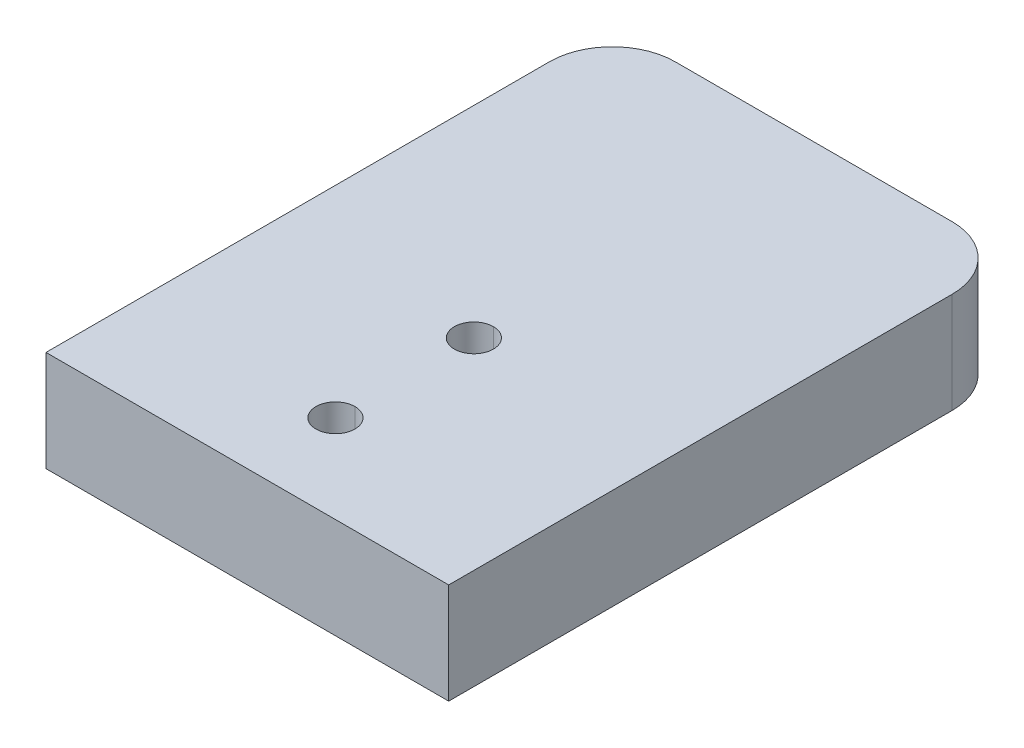
ISO-10303-21;
HEADER;
FILE_DESCRIPTION(('STEP AP214'),'2;1');
FILE_NAME('part.step','',(''),(''),'','','');
FILE_SCHEMA(('AUTOMOTIVE_DESIGN { 1 0 10303 214 1 1 1 1 }'));
ENDSEC;
DATA;
#1=APPLICATION_CONTEXT('core data for automotive mechanical design processes');
#2=APPLICATION_PROTOCOL_DEFINITION('international standard','automotive_design',2000,#1);
#3=PRODUCT_CONTEXT('',#1,'mechanical');
#4=PRODUCT('Part','Part','',(#3));
#5=PRODUCT_RELATED_PRODUCT_CATEGORY('part','',(#4));
#6=PRODUCT_DEFINITION_FORMATION('','',#4);
#7=PRODUCT_DEFINITION_CONTEXT('part definition',#1,'design');
#8=PRODUCT_DEFINITION('design','',#6,#7);
#9=PRODUCT_DEFINITION_SHAPE('','',#8);
#10=(LENGTH_UNIT() NAMED_UNIT(*) SI_UNIT(.MILLI.,.METRE.));
#11=(NAMED_UNIT(*) PLANE_ANGLE_UNIT() SI_UNIT($,.RADIAN.));
#12=(NAMED_UNIT(*) SI_UNIT($,.STERADIAN.) SOLID_ANGLE_UNIT());
#13=UNCERTAINTY_MEASURE_WITH_UNIT(LENGTH_MEASURE(1.E-05),#10,'distance_accuracy_value','');
#14=(GEOMETRIC_REPRESENTATION_CONTEXT(3) GLOBAL_UNCERTAINTY_ASSIGNED_CONTEXT((#13)) GLOBAL_UNIT_ASSIGNED_CONTEXT((#10,
#11,#12)) REPRESENTATION_CONTEXT('',''));
#15=CARTESIAN_POINT('',(0.,0.,0.));
#16=DIRECTION('',(0.,0.,1.));
#17=DIRECTION('',(1.,0.,0.));
#18=AXIS2_PLACEMENT_3D('',#15,#16,#17);
#19=CARTESIAN_POINT('',(0.,8.,4.5));
#20=DIRECTION('',(0.,-1.,0.));
#21=DIRECTION('',(0.,0.,-1.));
#22=AXIS2_PLACEMENT_3D('',#19,#20,#21);
#23=CYLINDRICAL_SURFACE('',#22,1.55);
#24=CARTESIAN_POINT('',(0.,8.,4.5));
#25=DIRECTION('',(0.,1.,0.));
#26=DIRECTION('',(0.,0.,1.));
#27=AXIS2_PLACEMENT_3D('',#24,#25,#26);
#28=CIRCLE('',#27,1.55);
#29=CARTESIAN_POINT('',(0.,8.,2.95));
#30=VERTEX_POINT('',#29);
#31=CARTESIAN_POINT('',(0.,8.,6.05));
#32=VERTEX_POINT('',#31);
#33=EDGE_CURVE('E281',#30,#32,#28,.T.);
#34=ORIENTED_EDGE('',*,*,#33,.T.);
#35=DIRECTION('',(0.,-1.,0.));
#36=VECTOR('',#35,1.);
#37=CARTESIAN_POINT('',(0.,8.,6.05));
#38=LINE('',#37,#36);
#39=CARTESIAN_POINT('',(0.,2.8,6.05));
#40=VERTEX_POINT('',#39);
#41=EDGE_CURVE('E307',#32,#40,#38,.T.);
#42=ORIENTED_EDGE('',*,*,#41,.T.);
#43=CARTESIAN_POINT('',(0.,2.8,4.5));
#44=DIRECTION('',(0.,-1.,0.));
#45=DIRECTION('',(0.,0.,-1.));
#46=AXIS2_PLACEMENT_3D('',#43,#44,#45);
#47=CIRCLE('',#46,1.55);
#48=CARTESIAN_POINT('',(0.,2.8,2.95));
#49=VERTEX_POINT('',#48);
#50=EDGE_CURVE('E337',#40,#49,#47,.T.);
#51=ORIENTED_EDGE('',*,*,#50,.T.);
#52=DIRECTION('',(0.,-1.,0.));
#53=VECTOR('',#52,1.);
#54=CARTESIAN_POINT('',(0.,8.,2.95));
#55=LINE('',#54,#53);
#56=EDGE_CURVE('E311',#30,#49,#55,.T.);
#57=ORIENTED_EDGE('',*,*,#56,.F.);
#58=EDGE_LOOP('',(#34,#42,#51,#57));
#59=FACE_BOUND('',#58,.T.);
#60=ADVANCED_FACE('F16',(#59),#23,.F.);
#61=CARTESIAN_POINT('',(0.,8.,15.5));
#62=DIRECTION('',(0.,-1.,0.));
#63=DIRECTION('',(0.,0.,-1.));
#64=AXIS2_PLACEMENT_3D('',#61,#62,#63);
#65=CYLINDRICAL_SURFACE('',#64,1.55);
#66=CARTESIAN_POINT('',(0.,8.,15.5));
#67=DIRECTION('',(0.,1.,0.));
#68=DIRECTION('',(0.,0.,1.));
#69=AXIS2_PLACEMENT_3D('',#66,#67,#68);
#70=CIRCLE('',#69,1.55);
#71=CARTESIAN_POINT('',(0.,8.,13.95));
#72=VERTEX_POINT('',#71);
#73=CARTESIAN_POINT('',(0.,8.,17.05));
#74=VERTEX_POINT('',#73);
#75=EDGE_CURVE('E328',#72,#74,#70,.T.);
#76=ORIENTED_EDGE('',*,*,#75,.T.);
#77=DIRECTION('',(0.,-1.,0.));
#78=VECTOR('',#77,1.);
#79=CARTESIAN_POINT('',(0.,8.,17.05));
#80=LINE('',#79,#78);
#81=CARTESIAN_POINT('',(0.,2.8,17.05));
#82=VERTEX_POINT('',#81);
#83=EDGE_CURVE('E27',#74,#82,#80,.T.);
#84=ORIENTED_EDGE('',*,*,#83,.T.);
#85=CARTESIAN_POINT('',(0.,2.8,15.5));
#86=DIRECTION('',(0.,-1.,0.));
#87=DIRECTION('',(0.,0.,-1.));
#88=AXIS2_PLACEMENT_3D('',#85,#86,#87);
#89=CIRCLE('',#88,1.55);
#90=CARTESIAN_POINT('',(0.,2.8,13.95));
#91=VERTEX_POINT('',#90);
#92=EDGE_CURVE('E318',#82,#91,#89,.T.);
#93=ORIENTED_EDGE('',*,*,#92,.T.);
#94=DIRECTION('',(0.,-1.,0.));
#95=VECTOR('',#94,1.);
#96=CARTESIAN_POINT('',(0.,8.,13.95));
#97=LINE('',#96,#95);
#98=EDGE_CURVE('E11',#72,#91,#97,.T.);
#99=ORIENTED_EDGE('',*,*,#98,.F.);
#100=EDGE_LOOP('',(#76,#84,#93,#99));
#101=FACE_BOUND('',#100,.T.);
#102=ADVANCED_FACE('F511',(#101),#65,.F.);
#103=CARTESIAN_POINT('',(0.,8.,15.5));
#104=DIRECTION('',(0.,-1.,0.));
#105=DIRECTION('',(0.,0.,-1.));
#106=AXIS2_PLACEMENT_3D('',#103,#104,#105);
#107=CYLINDRICAL_SURFACE('',#106,1.55);
#108=ORIENTED_EDGE('',*,*,#83,.F.);
#109=CARTESIAN_POINT('',(0.,8.,15.5));
#110=DIRECTION('',(0.,1.,0.));
#111=DIRECTION('',(0.,0.,1.));
#112=AXIS2_PLACEMENT_3D('',#109,#110,#111);
#113=CIRCLE('',#112,1.55);
#114=EDGE_CURVE('E312',#74,#72,#113,.T.);
#115=ORIENTED_EDGE('',*,*,#114,.T.);
#116=ORIENTED_EDGE('',*,*,#98,.T.);
#117=CARTESIAN_POINT('',(0.,2.8,15.5));
#118=DIRECTION('',(0.,-1.,0.));
#119=DIRECTION('',(0.,0.,-1.));
#120=AXIS2_PLACEMENT_3D('',#117,#118,#119);
#121=CIRCLE('',#120,1.55);
#122=EDGE_CURVE('E323',#91,#82,#121,.T.);
#123=ORIENTED_EDGE('',*,*,#122,.T.);
#124=EDGE_LOOP('',(#108,#115,#116,#123));
#125=FACE_BOUND('',#124,.T.);
#126=ADVANCED_FACE('F517',(#125),#107,.F.);
#127=CARTESIAN_POINT('',(0.,8.,4.5));
#128=DIRECTION('',(0.,-1.,0.));
#129=DIRECTION('',(0.,0.,-1.));
#130=AXIS2_PLACEMENT_3D('',#127,#128,#129);
#131=CYLINDRICAL_SURFACE('',#130,1.55);
#132=ORIENTED_EDGE('',*,*,#41,.F.);
#133=CARTESIAN_POINT('',(0.,8.,4.5));
#134=DIRECTION('',(0.,1.,0.));
#135=DIRECTION('',(0.,0.,1.));
#136=AXIS2_PLACEMENT_3D('',#133,#134,#135);
#137=CIRCLE('',#136,1.55);
#138=EDGE_CURVE('E324',#32,#30,#137,.T.);
#139=ORIENTED_EDGE('',*,*,#138,.T.);
#140=ORIENTED_EDGE('',*,*,#56,.T.);
#141=CARTESIAN_POINT('',(0.,2.8,4.5));
#142=DIRECTION('',(0.,-1.,0.));
#143=DIRECTION('',(0.,0.,-1.));
#144=AXIS2_PLACEMENT_3D('',#141,#142,#143);
#145=CIRCLE('',#144,1.55);
#146=EDGE_CURVE('E336',#49,#40,#145,.T.);
#147=ORIENTED_EDGE('',*,*,#146,.T.);
#148=EDGE_LOOP('',(#132,#139,#140,#147));
#149=FACE_BOUND('',#148,.T.);
#150=ADVANCED_FACE('F769',(#149),#131,.F.);
#151=CARTESIAN_POINT('',(0.,8.,0.));
#152=DIRECTION('',(0.,1.,0.));
#153=DIRECTION('',(1.,0.,0.));
#154=AXIS2_PLACEMENT_3D('',#151,#152,#153);
#155=PLANE('',#154);
#156=ORIENTED_EDGE('',*,*,#75,.F.);
#157=ORIENTED_EDGE('',*,*,#114,.F.);
#158=EDGE_LOOP('',(#156,#157));
#159=FACE_BOUND('',#158,.T.);
#160=ORIENTED_EDGE('',*,*,#33,.F.);
#161=ORIENTED_EDGE('',*,*,#138,.F.);
#162=EDGE_LOOP('',(#160,#161));
#163=FACE_BOUND('',#162,.T.);
#164=DIRECTION('',(0.,0.,-1.));
#165=VECTOR('',#164,1.);
#166=CARTESIAN_POINT('',(16.,8.,-22.5));
#167=LINE('',#166,#165);
#168=CARTESIAN_POINT('',(16.,8.,22.5));
#169=VERTEX_POINT('',#168);
#170=CARTESIAN_POINT('',(16.,8.,-17.5));
#171=VERTEX_POINT('',#170);
#172=EDGE_CURVE('E278',#169,#171,#167,.T.);
#173=ORIENTED_EDGE('',*,*,#172,.T.);
#174=CARTESIAN_POINT('',(11.,8.,-17.5));
#175=DIRECTION('',(0.,1.,0.));
#176=DIRECTION('',(0.,0.,1.));
#177=AXIS2_PLACEMENT_3D('',#174,#175,#176);
#178=CIRCLE('',#177,5.);
#179=CARTESIAN_POINT('',(11.,8.,-22.5));
#180=VERTEX_POINT('',#179);
#181=EDGE_CURVE('E424',#171,#180,#178,.T.);
#182=ORIENTED_EDGE('',*,*,#181,.T.);
#183=DIRECTION('',(-1.,0.,0.));
#184=VECTOR('',#183,1.);
#185=CARTESIAN_POINT('',(-16.,8.,-22.5));
#186=LINE('',#185,#184);
#187=CARTESIAN_POINT('',(-11.,8.,-22.5));
#188=VERTEX_POINT('',#187);
#189=EDGE_CURVE('E229',#180,#188,#186,.T.);
#190=ORIENTED_EDGE('',*,*,#189,.T.);
#191=CARTESIAN_POINT('',(-11.,8.,-17.5));
#192=DIRECTION('',(0.,1.,0.));
#193=DIRECTION('',(0.,0.,1.));
#194=AXIS2_PLACEMENT_3D('',#191,#192,#193);
#195=CIRCLE('',#194,5.);
#196=CARTESIAN_POINT('',(-16.,8.,-17.5));
#197=VERTEX_POINT('',#196);
#198=EDGE_CURVE('E287',#188,#197,#195,.T.);
#199=ORIENTED_EDGE('',*,*,#198,.T.);
#200=DIRECTION('',(0.,0.,1.));
#201=VECTOR('',#200,1.);
#202=CARTESIAN_POINT('',(-16.,8.,-22.5));
#203=LINE('',#202,#201);
#204=CARTESIAN_POINT('',(-16.,8.,22.5));
#205=VERTEX_POINT('',#204);
#206=EDGE_CURVE('E230',#197,#205,#203,.T.);
#207=ORIENTED_EDGE('',*,*,#206,.T.);
#208=DIRECTION('',(1.,0.,0.));
#209=VECTOR('',#208,1.);
#210=CARTESIAN_POINT('',(-16.,8.,22.5));
#211=LINE('',#210,#209);
#212=EDGE_CURVE('E238',#205,#169,#211,.T.);
#213=ORIENTED_EDGE('',*,*,#212,.T.);
#214=EDGE_LOOP('',(#173,#182,#190,#199,#207,#213));
#215=FACE_BOUND('',#214,.T.);
#216=ADVANCED_FACE('F760',(#159,#163,#215),#155,.T.);
#217=CARTESIAN_POINT('',(0.,0.,0.));
#218=DIRECTION('',(0.,1.,0.));
#219=DIRECTION('',(1.,0.,0.));
#220=AXIS2_PLACEMENT_3D('',#217,#218,#219);
#221=PLANE('',#220);
#222=DIRECTION('',(-0.5,0.,0.866025403784439));
#223=VECTOR('',#222,1.);
#224=CARTESIAN_POINT('',(3.34863156129984,0.,15.5));
#225=LINE('',#224,#223);
#226=CARTESIAN_POINT('',(3.34863156129984,0.,15.5));
#227=VERTEX_POINT('',#226);
#228=CARTESIAN_POINT('',(1.67431578064992,0.,18.4));
#229=VERTEX_POINT('',#228);
#230=EDGE_CURVE('E322',#227,#229,#225,.T.);
#231=ORIENTED_EDGE('',*,*,#230,.F.);
#232=DIRECTION('',(0.5,0.,0.866025403784439));
#233=VECTOR('',#232,1.);
#234=CARTESIAN_POINT('',(1.67431578064992,0.,12.6));
#235=LINE('',#234,#233);
#236=CARTESIAN_POINT('',(1.67431578064992,0.,12.6));
#237=VERTEX_POINT('',#236);
#238=EDGE_CURVE('E276',#237,#227,#235,.T.);
#239=ORIENTED_EDGE('',*,*,#238,.F.);
#240=DIRECTION('',(1.,0.,0.));
#241=VECTOR('',#240,1.);
#242=CARTESIAN_POINT('',(-1.67431578064991,0.,12.6));
#243=LINE('',#242,#241);
#244=CARTESIAN_POINT('',(-1.67431578064991,0.,12.6));
#245=VERTEX_POINT('',#244);
#246=EDGE_CURVE('E277',#245,#237,#243,.T.);
#247=ORIENTED_EDGE('',*,*,#246,.F.);
#248=DIRECTION('',(0.5,0.,-0.866025403784439));
#249=VECTOR('',#248,1.);
#250=CARTESIAN_POINT('',(-3.34863156129982,0.,15.5));
#251=LINE('',#250,#249);
#252=CARTESIAN_POINT('',(-3.34863156129982,0.,15.5));
#253=VERTEX_POINT('',#252);
#254=EDGE_CURVE('E317',#253,#245,#251,.T.);
#255=ORIENTED_EDGE('',*,*,#254,.F.);
#256=DIRECTION('',(-0.5,0.,-0.866025403784439));
#257=VECTOR('',#256,1.);
#258=CARTESIAN_POINT('',(-1.6743157806499,0.,18.4));
#259=LINE('',#258,#257);
#260=CARTESIAN_POINT('',(-1.6743157806499,0.,18.4));
#261=VERTEX_POINT('',#260);
#262=EDGE_CURVE('E355',#261,#253,#259,.T.);
#263=ORIENTED_EDGE('',*,*,#262,.F.);
#264=DIRECTION('',(-1.,0.,0.));
#265=VECTOR('',#264,1.);
#266=CARTESIAN_POINT('',(1.67431578064992,0.,18.4));
#267=LINE('',#266,#265);
#268=EDGE_CURVE('E331',#229,#261,#267,.T.);
#269=ORIENTED_EDGE('',*,*,#268,.F.);
#270=EDGE_LOOP('',(#231,#239,#247,#255,#263,#269));
#271=FACE_BOUND('',#270,.T.);
#272=DIRECTION('',(0.5,0.,0.866025403784439));
#273=VECTOR('',#272,1.);
#274=CARTESIAN_POINT('',(1.67431578064992,0.,1.6));
#275=LINE('',#274,#273);
#276=CARTESIAN_POINT('',(1.67431578064992,0.,1.6));
#277=VERTEX_POINT('',#276);
#278=CARTESIAN_POINT('',(3.34863156129984,0.,4.5));
#279=VERTEX_POINT('',#278);
#280=EDGE_CURVE('E341',#277,#279,#275,.T.);
#281=ORIENTED_EDGE('',*,*,#280,.F.);
#282=DIRECTION('',(1.,0.,0.));
#283=VECTOR('',#282,1.);
#284=CARTESIAN_POINT('',(-1.67431578064991,0.,1.6));
#285=LINE('',#284,#283);
#286=CARTESIAN_POINT('',(-1.67431578064991,0.,1.6));
#287=VERTEX_POINT('',#286);
#288=EDGE_CURVE('E247',#287,#277,#285,.T.);
#289=ORIENTED_EDGE('',*,*,#288,.F.);
#290=DIRECTION('',(0.5,0.,-0.866025403784439));
#291=VECTOR('',#290,1.);
#292=CARTESIAN_POINT('',(-3.34863156129982,0.,4.5));
#293=LINE('',#292,#291);
#294=CARTESIAN_POINT('',(-3.34863156129982,0.,4.5));
#295=VERTEX_POINT('',#294);
#296=EDGE_CURVE('E395',#295,#287,#293,.T.);
#297=ORIENTED_EDGE('',*,*,#296,.F.);
#298=DIRECTION('',(-0.5,0.,-0.866025403784439));
#299=VECTOR('',#298,1.);
#300=CARTESIAN_POINT('',(-1.67431578064991,0.,7.4));
#301=LINE('',#300,#299);
#302=CARTESIAN_POINT('',(-1.67431578064991,0.,7.4));
#303=VERTEX_POINT('',#302);
#304=EDGE_CURVE('E364',#303,#295,#301,.T.);
#305=ORIENTED_EDGE('',*,*,#304,.F.);
#306=DIRECTION('',(-1.,0.,0.));
#307=VECTOR('',#306,1.);
#308=CARTESIAN_POINT('',(1.67431578064992,0.,7.4));
#309=LINE('',#308,#307);
#310=CARTESIAN_POINT('',(1.67431578064992,0.,7.4));
#311=VERTEX_POINT('',#310);
#312=EDGE_CURVE('E292',#311,#303,#309,.T.);
#313=ORIENTED_EDGE('',*,*,#312,.F.);
#314=DIRECTION('',(-0.5,0.,0.866025403784439));
#315=VECTOR('',#314,1.);
#316=CARTESIAN_POINT('',(3.34863156129984,0.,4.5));
#317=LINE('',#316,#315);
#318=EDGE_CURVE('E293',#279,#311,#317,.T.);
#319=ORIENTED_EDGE('',*,*,#318,.F.);
#320=EDGE_LOOP('',(#281,#289,#297,#305,#313,#319));
#321=FACE_BOUND('',#320,.T.);
#322=DIRECTION('',(-1.,0.,0.));
#323=VECTOR('',#322,1.);
#324=CARTESIAN_POINT('',(-16.,0.,-22.5));
#325=LINE('',#324,#323);
#326=CARTESIAN_POINT('',(11.,0.,-22.5));
#327=VERTEX_POINT('',#326);
#328=CARTESIAN_POINT('',(-11.,0.,-22.5));
#329=VERTEX_POINT('',#328);
#330=EDGE_CURVE('E372',#327,#329,#325,.T.);
#331=ORIENTED_EDGE('',*,*,#330,.F.);
#332=CARTESIAN_POINT('',(11.,0.,-17.5));
#333=DIRECTION('',(0.,-1.,0.));
#334=DIRECTION('',(0.,0.,1.));
#335=AXIS2_PLACEMENT_3D('',#332,#333,#334);
#336=CIRCLE('',#335,5.);
#337=CARTESIAN_POINT('',(16.,0.,-17.5));
#338=VERTEX_POINT('',#337);
#339=EDGE_CURVE('E301',#327,#338,#336,.T.);
#340=ORIENTED_EDGE('',*,*,#339,.T.);
#341=DIRECTION('',(0.,0.,-1.));
#342=VECTOR('',#341,1.);
#343=CARTESIAN_POINT('',(16.,0.,-22.5));
#344=LINE('',#343,#342);
#345=CARTESIAN_POINT('',(16.,0.,22.5));
#346=VERTEX_POINT('',#345);
#347=EDGE_CURVE('E243',#346,#338,#344,.T.);
#348=ORIENTED_EDGE('',*,*,#347,.F.);
#349=DIRECTION('',(1.,0.,0.));
#350=VECTOR('',#349,1.);
#351=CARTESIAN_POINT('',(-16.,0.,22.5));
#352=LINE('',#351,#350);
#353=CARTESIAN_POINT('',(-16.,0.,22.5));
#354=VERTEX_POINT('',#353);
#355=EDGE_CURVE('E236',#354,#346,#352,.T.);
#356=ORIENTED_EDGE('',*,*,#355,.F.);
#357=DIRECTION('',(0.,0.,1.));
#358=VECTOR('',#357,1.);
#359=CARTESIAN_POINT('',(-16.,0.,-22.5));
#360=LINE('',#359,#358);
#361=CARTESIAN_POINT('',(-16.,0.,-17.5));
#362=VERTEX_POINT('',#361);
#363=EDGE_CURVE('E217',#362,#354,#360,.T.);
#364=ORIENTED_EDGE('',*,*,#363,.F.);
#365=CARTESIAN_POINT('',(-11.,0.,-17.5));
#366=DIRECTION('',(0.,-1.,0.));
#367=DIRECTION('',(0.,0.,1.));
#368=AXIS2_PLACEMENT_3D('',#365,#366,#367);
#369=CIRCLE('',#368,5.);
#370=EDGE_CURVE('E286',#362,#329,#369,.T.);
#371=ORIENTED_EDGE('',*,*,#370,.T.);
#372=EDGE_LOOP('',(#331,#340,#348,#356,#364,#371));
#373=FACE_BOUND('',#372,.T.);
#374=ADVANCED_FACE('F241',(#271,#321,#373),#221,.F.);
#375=CARTESIAN_POINT('',(16.,8.,-22.5));
#376=DIRECTION('',(-1.,0.,0.));
#377=DIRECTION('',(0.,1.,0.));
#378=AXIS2_PLACEMENT_3D('',#375,#376,#377);
#379=PLANE('',#378);
#380=ORIENTED_EDGE('',*,*,#347,.T.);
#381=DIRECTION('',(0.,1.,0.));
#382=VECTOR('',#381,1.);
#383=CARTESIAN_POINT('',(16.,8.,-17.5));
#384=LINE('',#383,#382);
#385=EDGE_CURVE('E428',#338,#171,#384,.T.);
#386=ORIENTED_EDGE('',*,*,#385,.T.);
#387=ORIENTED_EDGE('',*,*,#172,.F.);
#388=DIRECTION('',(0.,-1.,0.));
#389=VECTOR('',#388,1.);
#390=CARTESIAN_POINT('',(16.,8.,22.5));
#391=LINE('',#390,#389);
#392=EDGE_CURVE('E246',#169,#346,#391,.T.);
#393=ORIENTED_EDGE('',*,*,#392,.T.);
#394=EDGE_LOOP('',(#380,#386,#387,#393));
#395=FACE_BOUND('',#394,.T.);
#396=ADVANCED_FACE('F759',(#395),#379,.F.);
#397=CARTESIAN_POINT('',(-16.,8.,-22.5));
#398=DIRECTION('',(0.,0.,1.));
#399=DIRECTION('',(1.,0.,0.));
#400=AXIS2_PLACEMENT_3D('',#397,#398,#399);
#401=PLANE('',#400);
#402=ORIENTED_EDGE('',*,*,#189,.F.);
#403=DIRECTION('',(0.,-1.,0.));
#404=VECTOR('',#403,1.);
#405=CARTESIAN_POINT('',(11.,8.,-22.5));
#406=LINE('',#405,#404);
#407=EDGE_CURVE('E265',#180,#327,#406,.T.);
#408=ORIENTED_EDGE('',*,*,#407,.T.);
#409=ORIENTED_EDGE('',*,*,#330,.T.);
#410=DIRECTION('',(0.,1.,0.));
#411=VECTOR('',#410,1.);
#412=CARTESIAN_POINT('',(-11.,8.,-22.5));
#413=LINE('',#412,#411);
#414=EDGE_CURVE('E282',#329,#188,#413,.T.);
#415=ORIENTED_EDGE('',*,*,#414,.T.);
#416=EDGE_LOOP('',(#402,#408,#409,#415));
#417=FACE_BOUND('',#416,.T.);
#418=ADVANCED_FACE('F787',(#417),#401,.F.);
#419=CARTESIAN_POINT('',(-16.,8.,-22.5));
#420=DIRECTION('',(1.,0.,0.));
#421=DIRECTION('',(0.,0.,-1.));
#422=AXIS2_PLACEMENT_3D('',#419,#420,#421);
#423=PLANE('',#422);
#424=ORIENTED_EDGE('',*,*,#206,.F.);
#425=DIRECTION('',(0.,-1.,0.));
#426=VECTOR('',#425,1.);
#427=CARTESIAN_POINT('',(-16.,8.,-17.5));
#428=LINE('',#427,#426);
#429=EDGE_CURVE('E223',#197,#362,#428,.T.);
#430=ORIENTED_EDGE('',*,*,#429,.T.);
#431=ORIENTED_EDGE('',*,*,#363,.T.);
#432=DIRECTION('',(0.,-1.,0.));
#433=VECTOR('',#432,1.);
#434=CARTESIAN_POINT('',(-16.,8.,22.5));
#435=LINE('',#434,#433);
#436=EDGE_CURVE('E220',#205,#354,#435,.T.);
#437=ORIENTED_EDGE('',*,*,#436,.F.);
#438=EDGE_LOOP('',(#424,#430,#431,#437));
#439=FACE_BOUND('',#438,.T.);
#440=ADVANCED_FACE('F219',(#439),#423,.F.);
#441=CARTESIAN_POINT('',(-16.,8.,22.5));
#442=DIRECTION('',(0.,0.,-1.));
#443=DIRECTION('',(0.,-1.,0.));
#444=AXIS2_PLACEMENT_3D('',#441,#442,#443);
#445=PLANE('',#444);
#446=ORIENTED_EDGE('',*,*,#355,.T.);
#447=ORIENTED_EDGE('',*,*,#392,.F.);
#448=ORIENTED_EDGE('',*,*,#212,.F.);
#449=ORIENTED_EDGE('',*,*,#436,.T.);
#450=EDGE_LOOP('',(#446,#447,#448,#449));
#451=FACE_BOUND('',#450,.T.);
#452=ADVANCED_FACE('F234',(#451),#445,.F.);
#453=CARTESIAN_POINT('',(-1.67431578064991,2.8,1.6));
#454=DIRECTION('',(0.,0.,-1.));
#455=DIRECTION('',(0.,-1.,0.));
#456=AXIS2_PLACEMENT_3D('',#453,#454,#455);
#457=PLANE('',#456);
#458=ORIENTED_EDGE('',*,*,#288,.T.);
#459=DIRECTION('',(0.,-1.,0.));
#460=VECTOR('',#459,1.);
#461=CARTESIAN_POINT('',(1.67431578064992,2.8,1.6));
#462=LINE('',#461,#460);
#463=CARTESIAN_POINT('',(1.67431578064992,2.8,1.6));
#464=VERTEX_POINT('',#463);
#465=EDGE_CURVE('E345',#464,#277,#462,.T.);
#466=ORIENTED_EDGE('',*,*,#465,.F.);
#467=DIRECTION('',(1.,0.,0.));
#468=VECTOR('',#467,1.);
#469=CARTESIAN_POINT('',(-1.67431578064991,2.8,1.6));
#470=LINE('',#469,#468);
#471=CARTESIAN_POINT('',(-1.67431578064991,2.8,1.6));
#472=VERTEX_POINT('',#471);
#473=EDGE_CURVE('E365',#472,#464,#470,.T.);
#474=ORIENTED_EDGE('',*,*,#473,.F.);
#475=DIRECTION('',(0.,-1.,0.));
#476=VECTOR('',#475,1.);
#477=CARTESIAN_POINT('',(-1.67431578064991,2.8,1.6));
#478=LINE('',#477,#476);
#479=EDGE_CURVE('E256',#472,#287,#478,.T.);
#480=ORIENTED_EDGE('',*,*,#479,.T.);
#481=EDGE_LOOP('',(#458,#466,#474,#480));
#482=FACE_BOUND('',#481,.T.);
#483=ADVANCED_FACE('F493',(#482),#457,.F.);
#484=CARTESIAN_POINT('',(-3.34863156129982,2.8,4.5));
#485=DIRECTION('',(-0.866025403784439,0.,-0.5));
#486=DIRECTION('',(-0.5,0.,0.866025403784439));
#487=AXIS2_PLACEMENT_3D('',#484,#485,#486);
#488=PLANE('',#487);
#489=ORIENTED_EDGE('',*,*,#296,.T.);
#490=ORIENTED_EDGE('',*,*,#479,.F.);
#491=DIRECTION('',(0.5,0.,-0.866025403784439));
#492=VECTOR('',#491,1.);
#493=CARTESIAN_POINT('',(-3.34863156129982,2.8,4.5));
#494=LINE('',#493,#492);
#495=CARTESIAN_POINT('',(-3.34863156129982,2.8,4.5));
#496=VERTEX_POINT('',#495);
#497=EDGE_CURVE('E332',#496,#472,#494,.T.);
#498=ORIENTED_EDGE('',*,*,#497,.F.);
#499=DIRECTION('',(0.,-1.,0.));
#500=VECTOR('',#499,1.);
#501=CARTESIAN_POINT('',(-3.34863156129982,2.8,4.5));
#502=LINE('',#501,#500);
#503=EDGE_CURVE('E399',#496,#295,#502,.T.);
#504=ORIENTED_EDGE('',*,*,#503,.T.);
#505=EDGE_LOOP('',(#489,#490,#498,#504));
#506=FACE_BOUND('',#505,.T.);
#507=ADVANCED_FACE('F489',(#506),#488,.F.);
#508=CARTESIAN_POINT('',(-1.67431578064991,2.8,7.4));
#509=DIRECTION('',(-0.866025403784439,0.,0.5));
#510=DIRECTION('',(0.,1.,0.));
#511=AXIS2_PLACEMENT_3D('',#508,#509,#510);
#512=PLANE('',#511);
#513=ORIENTED_EDGE('',*,*,#304,.T.);
#514=ORIENTED_EDGE('',*,*,#503,.F.);
#515=DIRECTION('',(-0.5,0.,-0.866025403784439));
#516=VECTOR('',#515,1.);
#517=CARTESIAN_POINT('',(-1.67431578064991,2.8,7.4));
#518=LINE('',#517,#516);
#519=CARTESIAN_POINT('',(-1.67431578064991,2.8,7.4));
#520=VERTEX_POINT('',#519);
#521=EDGE_CURVE('E270',#520,#496,#518,.T.);
#522=ORIENTED_EDGE('',*,*,#521,.F.);
#523=DIRECTION('',(0.,-1.,0.));
#524=VECTOR('',#523,1.);
#525=CARTESIAN_POINT('',(-1.67431578064991,2.8,7.4));
#526=LINE('',#525,#524);
#527=EDGE_CURVE('E306',#520,#303,#526,.T.);
#528=ORIENTED_EDGE('',*,*,#527,.T.);
#529=EDGE_LOOP('',(#513,#514,#522,#528));
#530=FACE_BOUND('',#529,.T.);
#531=ADVANCED_FACE('F487',(#530),#512,.F.);
#532=CARTESIAN_POINT('',(1.67431578064992,2.8,7.4));
#533=DIRECTION('',(0.,0.,1.));
#534=DIRECTION('',(1.,0.,0.));
#535=AXIS2_PLACEMENT_3D('',#532,#533,#534);
#536=PLANE('',#535);
#537=ORIENTED_EDGE('',*,*,#312,.T.);
#538=ORIENTED_EDGE('',*,*,#527,.F.);
#539=DIRECTION('',(-1.,0.,0.));
#540=VECTOR('',#539,1.);
#541=CARTESIAN_POINT('',(1.67431578064992,2.8,7.4));
#542=LINE('',#541,#540);
#543=CARTESIAN_POINT('',(1.67431578064992,2.8,7.4));
#544=VERTEX_POINT('',#543);
#545=EDGE_CURVE('E266',#544,#520,#542,.T.);
#546=ORIENTED_EDGE('',*,*,#545,.F.);
#547=DIRECTION('',(0.,-1.,0.));
#548=VECTOR('',#547,1.);
#549=CARTESIAN_POINT('',(1.67431578064992,2.8,7.4));
#550=LINE('',#549,#548);
#551=EDGE_CURVE('E288',#544,#311,#550,.T.);
#552=ORIENTED_EDGE('',*,*,#551,.T.);
#553=EDGE_LOOP('',(#537,#538,#546,#552));
#554=FACE_BOUND('',#553,.T.);
#555=ADVANCED_FACE('F506',(#554),#536,.F.);
#556=CARTESIAN_POINT('',(3.34863156129984,2.8,4.5));
#557=DIRECTION('',(0.866025403784439,0.,0.5));
#558=DIRECTION('',(0.,-1.,0.));
#559=AXIS2_PLACEMENT_3D('',#556,#557,#558);
#560=PLANE('',#559);
#561=ORIENTED_EDGE('',*,*,#318,.T.);
#562=ORIENTED_EDGE('',*,*,#551,.F.);
#563=DIRECTION('',(-0.5,0.,0.866025403784439));
#564=VECTOR('',#563,1.);
#565=CARTESIAN_POINT('',(3.34863156129984,2.8,4.5));
#566=LINE('',#565,#564);
#567=CARTESIAN_POINT('',(3.34863156129984,2.8,4.5));
#568=VERTEX_POINT('',#567);
#569=EDGE_CURVE('E271',#568,#544,#566,.T.);
#570=ORIENTED_EDGE('',*,*,#569,.F.);
#571=DIRECTION('',(0.,-1.,0.));
#572=VECTOR('',#571,1.);
#573=CARTESIAN_POINT('',(3.34863156129984,2.8,4.5));
#574=LINE('',#573,#572);
#575=EDGE_CURVE('E409',#568,#279,#574,.T.);
#576=ORIENTED_EDGE('',*,*,#575,.T.);
#577=EDGE_LOOP('',(#561,#562,#570,#576));
#578=FACE_BOUND('',#577,.T.);
#579=ADVANCED_FACE('F471',(#578),#560,.F.);
#580=CARTESIAN_POINT('',(1.67431578064992,2.8,1.6));
#581=DIRECTION('',(0.866025403784439,0.,-0.5));
#582=DIRECTION('',(0.,-1.,0.));
#583=AXIS2_PLACEMENT_3D('',#580,#581,#582);
#584=PLANE('',#583);
#585=ORIENTED_EDGE('',*,*,#280,.T.);
#586=ORIENTED_EDGE('',*,*,#575,.F.);
#587=DIRECTION('',(0.5,0.,0.866025403784439));
#588=VECTOR('',#587,1.);
#589=CARTESIAN_POINT('',(1.67431578064992,2.8,1.6));
#590=LINE('',#589,#588);
#591=EDGE_CURVE('E368',#464,#568,#590,.T.);
#592=ORIENTED_EDGE('',*,*,#591,.F.);
#593=ORIENTED_EDGE('',*,*,#465,.T.);
#594=EDGE_LOOP('',(#585,#586,#592,#593));
#595=FACE_BOUND('',#594,.T.);
#596=ADVANCED_FACE('F495',(#595),#584,.F.);
#597=CARTESIAN_POINT('',(0.,2.8,0.));
#598=DIRECTION('',(0.,-1.,0.));
#599=DIRECTION('',(0.,0.,-1.));
#600=AXIS2_PLACEMENT_3D('',#597,#598,#599);
#601=PLANE('',#600);
#602=ORIENTED_EDGE('',*,*,#146,.F.);
#603=ORIENTED_EDGE('',*,*,#50,.F.);
#604=EDGE_LOOP('',(#602,#603));
#605=FACE_BOUND('',#604,.T.);
#606=ORIENTED_EDGE('',*,*,#473,.T.);
#607=ORIENTED_EDGE('',*,*,#591,.T.);
#608=ORIENTED_EDGE('',*,*,#569,.T.);
#609=ORIENTED_EDGE('',*,*,#545,.T.);
#610=ORIENTED_EDGE('',*,*,#521,.T.);
#611=ORIENTED_EDGE('',*,*,#497,.T.);
#612=EDGE_LOOP('',(#606,#607,#608,#609,#610,#611));
#613=FACE_BOUND('',#612,.T.);
#614=ADVANCED_FACE('F467',(#605,#613),#601,.T.);
#615=CARTESIAN_POINT('',(1.67431578064992,2.8,12.6));
#616=DIRECTION('',(0.866025403784439,0.,-0.5));
#617=DIRECTION('',(0.,-1.,0.));
#618=AXIS2_PLACEMENT_3D('',#615,#616,#617);
#619=PLANE('',#618);
#620=ORIENTED_EDGE('',*,*,#238,.T.);
#621=DIRECTION('',(0.,-1.,0.));
#622=VECTOR('',#621,1.);
#623=CARTESIAN_POINT('',(3.34863156129984,2.8,15.5));
#624=LINE('',#623,#622);
#625=CARTESIAN_POINT('',(3.34863156129984,2.8,15.5));
#626=VERTEX_POINT('',#625);
#627=EDGE_CURVE('E130',#626,#227,#624,.T.);
#628=ORIENTED_EDGE('',*,*,#627,.F.);
#629=DIRECTION('',(0.5,0.,0.866025403784439));
#630=VECTOR('',#629,1.);
#631=CARTESIAN_POINT('',(1.67431578064992,2.8,12.6));
#632=LINE('',#631,#630);
#633=CARTESIAN_POINT('',(1.67431578064992,2.8,12.6));
#634=VERTEX_POINT('',#633);
#635=EDGE_CURVE('E260',#634,#626,#632,.T.);
#636=ORIENTED_EDGE('',*,*,#635,.F.);
#637=DIRECTION('',(0.,-1.,0.));
#638=VECTOR('',#637,1.);
#639=CARTESIAN_POINT('',(1.67431578064992,2.8,12.6));
#640=LINE('',#639,#638);
#641=EDGE_CURVE('E272',#634,#237,#640,.T.);
#642=ORIENTED_EDGE('',*,*,#641,.T.);
#643=EDGE_LOOP('',(#620,#628,#636,#642));
#644=FACE_BOUND('',#643,.T.);
#645=ADVANCED_FACE('F503',(#644),#619,.F.);
#646=CARTESIAN_POINT('',(-1.67431578064991,2.8,12.6));
#647=DIRECTION('',(0.,0.,-1.));
#648=DIRECTION('',(0.,-1.,0.));
#649=AXIS2_PLACEMENT_3D('',#646,#647,#648);
#650=PLANE('',#649);
#651=ORIENTED_EDGE('',*,*,#246,.T.);
#652=ORIENTED_EDGE('',*,*,#641,.F.);
#653=DIRECTION('',(1.,0.,0.));
#654=VECTOR('',#653,1.);
#655=CARTESIAN_POINT('',(-1.67431578064991,2.8,12.6));
#656=LINE('',#655,#654);
#657=CARTESIAN_POINT('',(-1.67431578064991,2.8,12.6));
#658=VERTEX_POINT('',#657);
#659=EDGE_CURVE('E20',#658,#634,#656,.T.);
#660=ORIENTED_EDGE('',*,*,#659,.F.);
#661=DIRECTION('',(0.,-1.,0.));
#662=VECTOR('',#661,1.);
#663=CARTESIAN_POINT('',(-1.67431578064991,2.8,12.6));
#664=LINE('',#663,#662);
#665=EDGE_CURVE('E313',#658,#245,#664,.T.);
#666=ORIENTED_EDGE('',*,*,#665,.T.);
#667=EDGE_LOOP('',(#651,#652,#660,#666));
#668=FACE_BOUND('',#667,.T.);
#669=ADVANCED_FACE('F18',(#668),#650,.F.);
#670=CARTESIAN_POINT('',(-3.34863156129982,2.8,15.5));
#671=DIRECTION('',(-0.866025403784439,0.,-0.5));
#672=DIRECTION('',(-0.5,0.,0.866025403784439));
#673=AXIS2_PLACEMENT_3D('',#670,#671,#672);
#674=PLANE('',#673);
#675=ORIENTED_EDGE('',*,*,#254,.T.);
#676=ORIENTED_EDGE('',*,*,#665,.F.);
#677=DIRECTION('',(0.5,0.,-0.866025403784439));
#678=VECTOR('',#677,1.);
#679=CARTESIAN_POINT('',(-3.34863156129982,2.8,15.5));
#680=LINE('',#679,#678);
#681=CARTESIAN_POINT('',(-3.34863156129982,2.8,15.5));
#682=VERTEX_POINT('',#681);
#683=EDGE_CURVE('E378',#682,#658,#680,.T.);
#684=ORIENTED_EDGE('',*,*,#683,.F.);
#685=DIRECTION('',(0.,-1.,0.));
#686=VECTOR('',#685,1.);
#687=CARTESIAN_POINT('',(-3.34863156129982,2.8,15.5));
#688=LINE('',#687,#686);
#689=EDGE_CURVE('E359',#682,#253,#688,.T.);
#690=ORIENTED_EDGE('',*,*,#689,.T.);
#691=EDGE_LOOP('',(#675,#676,#684,#690));
#692=FACE_BOUND('',#691,.T.);
#693=ADVANCED_FACE('F536',(#692),#674,.F.);
#694=CARTESIAN_POINT('',(-1.6743157806499,2.8,18.4));
#695=DIRECTION('',(-0.866025403784439,0.,0.5));
#696=DIRECTION('',(0.,1.,0.));
#697=AXIS2_PLACEMENT_3D('',#694,#695,#696);
#698=PLANE('',#697);
#699=ORIENTED_EDGE('',*,*,#262,.T.);
#700=ORIENTED_EDGE('',*,*,#689,.F.);
#701=DIRECTION('',(-0.5,0.,-0.866025403784439));
#702=VECTOR('',#701,1.);
#703=CARTESIAN_POINT('',(-1.6743157806499,2.8,18.4));
#704=LINE('',#703,#702);
#705=CARTESIAN_POINT('',(-1.6743157806499,2.8,18.4));
#706=VERTEX_POINT('',#705);
#707=EDGE_CURVE('E298',#706,#682,#704,.T.);
#708=ORIENTED_EDGE('',*,*,#707,.F.);
#709=DIRECTION('',(0.,-1.,0.));
#710=VECTOR('',#709,1.);
#711=CARTESIAN_POINT('',(-1.6743157806499,2.8,18.4));
#712=LINE('',#711,#710);
#713=EDGE_CURVE('E360',#706,#261,#712,.T.);
#714=ORIENTED_EDGE('',*,*,#713,.T.);
#715=EDGE_LOOP('',(#699,#700,#708,#714));
#716=FACE_BOUND('',#715,.T.);
#717=ADVANCED_FACE('F830',(#716),#698,.F.);
#718=CARTESIAN_POINT('',(1.67431578064992,2.8,18.4));
#719=DIRECTION('',(0.,0.,1.));
#720=DIRECTION('',(1.,0.,0.));
#721=AXIS2_PLACEMENT_3D('',#718,#719,#720);
#722=PLANE('',#721);
#723=ORIENTED_EDGE('',*,*,#268,.T.);
#724=ORIENTED_EDGE('',*,*,#713,.F.);
#725=DIRECTION('',(-1.,0.,0.));
#726=VECTOR('',#725,1.);
#727=CARTESIAN_POINT('',(1.67431578064992,2.8,18.4));
#728=LINE('',#727,#726);
#729=CARTESIAN_POINT('',(1.67431578064992,2.8,18.4));
#730=VERTEX_POINT('',#729);
#731=EDGE_CURVE('E294',#730,#706,#728,.T.);
#732=ORIENTED_EDGE('',*,*,#731,.F.);
#733=DIRECTION('',(0.,-1.,0.));
#734=VECTOR('',#733,1.);
#735=CARTESIAN_POINT('',(1.67431578064992,2.8,18.4));
#736=LINE('',#735,#734);
#737=EDGE_CURVE('E114',#730,#229,#736,.T.);
#738=ORIENTED_EDGE('',*,*,#737,.T.);
#739=EDGE_LOOP('',(#723,#724,#732,#738));
#740=FACE_BOUND('',#739,.T.);
#741=ADVANCED_FACE('F543',(#740),#722,.F.);
#742=CARTESIAN_POINT('',(3.34863156129984,2.8,15.5));
#743=DIRECTION('',(0.866025403784439,0.,0.5));
#744=DIRECTION('',(0.,-1.,0.));
#745=AXIS2_PLACEMENT_3D('',#742,#743,#744);
#746=PLANE('',#745);
#747=ORIENTED_EDGE('',*,*,#230,.T.);
#748=ORIENTED_EDGE('',*,*,#737,.F.);
#749=DIRECTION('',(-0.5,0.,0.866025403784439));
#750=VECTOR('',#749,1.);
#751=CARTESIAN_POINT('',(3.34863156129984,2.8,15.5));
#752=LINE('',#751,#750);
#753=EDGE_CURVE('E264',#626,#730,#752,.T.);
#754=ORIENTED_EDGE('',*,*,#753,.F.);
#755=ORIENTED_EDGE('',*,*,#627,.T.);
#756=EDGE_LOOP('',(#747,#748,#754,#755));
#757=FACE_BOUND('',#756,.T.);
#758=ADVANCED_FACE('F530',(#757),#746,.F.);
#759=CARTESIAN_POINT('',(0.,2.8,0.));
#760=DIRECTION('',(0.,-1.,0.));
#761=DIRECTION('',(0.,0.,-1.));
#762=AXIS2_PLACEMENT_3D('',#759,#760,#761);
#763=PLANE('',#762);
#764=ORIENTED_EDGE('',*,*,#122,.F.);
#765=ORIENTED_EDGE('',*,*,#92,.F.);
#766=EDGE_LOOP('',(#764,#765));
#767=FACE_BOUND('',#766,.T.);
#768=ORIENTED_EDGE('',*,*,#635,.T.);
#769=ORIENTED_EDGE('',*,*,#753,.T.);
#770=ORIENTED_EDGE('',*,*,#731,.T.);
#771=ORIENTED_EDGE('',*,*,#707,.T.);
#772=ORIENTED_EDGE('',*,*,#683,.T.);
#773=ORIENTED_EDGE('',*,*,#659,.T.);
#774=EDGE_LOOP('',(#768,#769,#770,#771,#772,#773));
#775=FACE_BOUND('',#774,.T.);
#776=ADVANCED_FACE('F527',(#767,#775),#763,.T.);
#777=CARTESIAN_POINT('',(11.,8.,-17.5));
#778=DIRECTION('',(0.,-1.,0.));
#779=DIRECTION('',(0.,0.,-1.));
#780=AXIS2_PLACEMENT_3D('',#777,#778,#779);
#781=CYLINDRICAL_SURFACE('',#780,5.);
#782=ORIENTED_EDGE('',*,*,#181,.F.);
#783=ORIENTED_EDGE('',*,*,#385,.F.);
#784=ORIENTED_EDGE('',*,*,#339,.F.);
#785=ORIENTED_EDGE('',*,*,#407,.F.);
#786=EDGE_LOOP('',(#782,#783,#784,#785));
#787=FACE_BOUND('',#786,.T.);
#788=ADVANCED_FACE('F523',(#787),#781,.T.);
#789=CARTESIAN_POINT('',(-11.,8.,-17.5));
#790=DIRECTION('',(0.,-1.,0.));
#791=DIRECTION('',(0.,0.,-1.));
#792=AXIS2_PLACEMENT_3D('',#789,#790,#791);
#793=CYLINDRICAL_SURFACE('',#792,5.);
#794=ORIENTED_EDGE('',*,*,#198,.F.);
#795=ORIENTED_EDGE('',*,*,#414,.F.);
#796=ORIENTED_EDGE('',*,*,#370,.F.);
#797=ORIENTED_EDGE('',*,*,#429,.F.);
#798=EDGE_LOOP('',(#794,#795,#796,#797));
#799=FACE_BOUND('',#798,.T.);
#800=ADVANCED_FACE('F526',(#799),#793,.T.);
#801=CLOSED_SHELL('',(#60,#102,#126,#150,#216,#374,#396,#418,#440,#452,#483,#507,#531,#555,#579,
#596,#614,#645,#669,#693,#717,#741,#758,#776,#788,#800));
#802=MANIFOLD_SOLID_BREP('B1',#801);
#803=ADVANCED_BREP_SHAPE_REPRESENTATION('',(#18,#802),#14);
#804=SHAPE_DEFINITION_REPRESENTATION(#9,#803);
ENDSEC;
END-ISO-10303-21;
